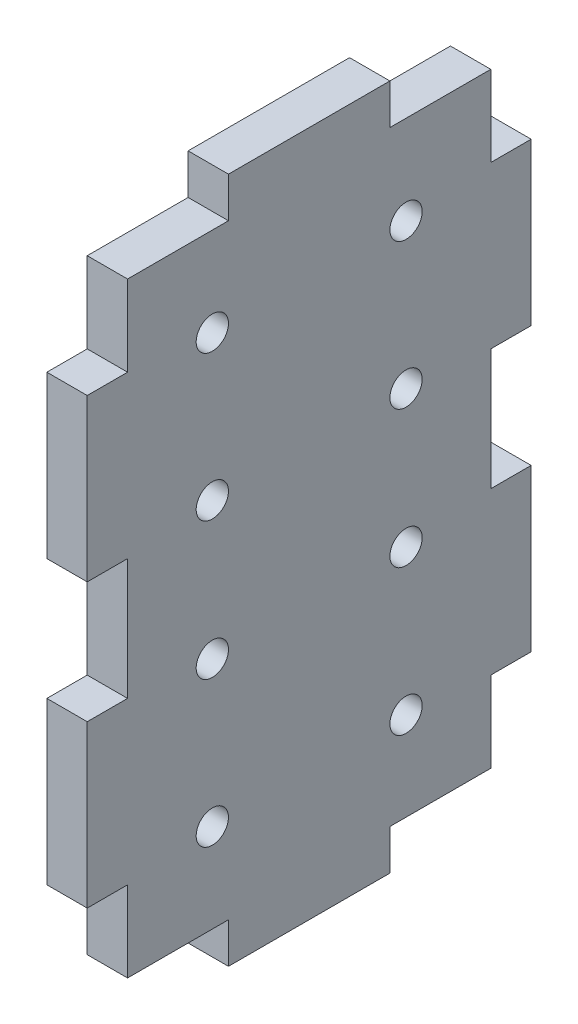
ISO-10303-21;
HEADER;
FILE_DESCRIPTION(('STEP AP214'),'2;1');
FILE_NAME('part.step','',(''),(''),'','','');
FILE_SCHEMA(('AUTOMOTIVE_DESIGN { 1 0 10303 214 1 1 1 1 }'));
ENDSEC;
DATA;
#1=APPLICATION_CONTEXT('core data for automotive mechanical design processes');
#2=APPLICATION_PROTOCOL_DEFINITION('international standard','automotive_design',2000,#1);
#3=PRODUCT_CONTEXT('',#1,'mechanical');
#4=PRODUCT('Part','Part','',(#3));
#5=PRODUCT_RELATED_PRODUCT_CATEGORY('part','',(#4));
#6=PRODUCT_DEFINITION_FORMATION('','',#4);
#7=PRODUCT_DEFINITION_CONTEXT('part definition',#1,'design');
#8=PRODUCT_DEFINITION('design','',#6,#7);
#9=PRODUCT_DEFINITION_SHAPE('','',#8);
#10=(LENGTH_UNIT() NAMED_UNIT(*) SI_UNIT(.MILLI.,.METRE.));
#11=(NAMED_UNIT(*) PLANE_ANGLE_UNIT() SI_UNIT($,.RADIAN.));
#12=(NAMED_UNIT(*) SI_UNIT($,.STERADIAN.) SOLID_ANGLE_UNIT());
#13=UNCERTAINTY_MEASURE_WITH_UNIT(LENGTH_MEASURE(1.E-05),#10,'distance_accuracy_value','');
#14=(GEOMETRIC_REPRESENTATION_CONTEXT(3) GLOBAL_UNCERTAINTY_ASSIGNED_CONTEXT((#13)) GLOBAL_UNIT_ASSIGNED_CONTEXT((#10,
#11,#12)) REPRESENTATION_CONTEXT('',''));
#15=CARTESIAN_POINT('',(0.,0.,0.));
#16=DIRECTION('',(0.,0.,1.));
#17=DIRECTION('',(1.,0.,0.));
#18=AXIS2_PLACEMENT_3D('',#15,#16,#17);
#19=CARTESIAN_POINT('',(5.,0.,0.));
#20=DIRECTION('',(-1.,0.,0.));
#21=DIRECTION('',(0.,0.,1.));
#22=AXIS2_PLACEMENT_3D('',#19,#20,#21);
#23=PLANE('',#22);
#24=DIRECTION('',(0.,1.,0.));
#25=VECTOR('',#24,1.);
#26=CARTESIAN_POINT('',(5.,0.,0.));
#27=LINE('',#26,#25);
#28=CARTESIAN_POINT('',(5.,0.,0.));
#29=VERTEX_POINT('',#28);
#30=CARTESIAN_POINT('',(5.,10.,0.));
#31=VERTEX_POINT('',#30);
#32=EDGE_CURVE('E306',#29,#31,#27,.T.);
#33=ORIENTED_EDGE('',*,*,#32,.T.);
#34=DIRECTION('',(0.,0.,-1.));
#35=VECTOR('',#34,1.);
#36=CARTESIAN_POINT('',(5.,10.,0.));
#37=LINE('',#36,#35);
#38=CARTESIAN_POINT('',(5.,10.,-5.));
#39=VERTEX_POINT('',#38);
#40=EDGE_CURVE('E154',#31,#39,#37,.T.);
#41=ORIENTED_EDGE('',*,*,#40,.T.);
#42=DIRECTION('',(0.,1.,0.));
#43=VECTOR('',#42,1.);
#44=CARTESIAN_POINT('',(5.,10.,-5.));
#45=LINE('',#44,#43);
#46=CARTESIAN_POINT('',(5.,30.,-5.));
#47=VERTEX_POINT('',#46);
#48=EDGE_CURVE('E381',#39,#47,#45,.T.);
#49=ORIENTED_EDGE('',*,*,#48,.T.);
#50=DIRECTION('',(0.,0.,1.));
#51=VECTOR('',#50,1.);
#52=CARTESIAN_POINT('',(5.,30.,0.));
#53=LINE('',#52,#51);
#54=CARTESIAN_POINT('',(5.,30.,0.));
#55=VERTEX_POINT('',#54);
#56=EDGE_CURVE('E400',#47,#55,#53,.T.);
#57=ORIENTED_EDGE('',*,*,#56,.T.);
#58=DIRECTION('',(0.,1.,0.));
#59=VECTOR('',#58,1.);
#60=CARTESIAN_POINT('',(5.,30.,0.));
#61=LINE('',#60,#59);
#62=CARTESIAN_POINT('',(5.,45.,0.));
#63=VERTEX_POINT('',#62);
#64=EDGE_CURVE('E397',#55,#63,#61,.T.);
#65=ORIENTED_EDGE('',*,*,#64,.T.);
#66=DIRECTION('',(0.,0.,-1.));
#67=VECTOR('',#66,1.);
#68=CARTESIAN_POINT('',(5.,45.,0.));
#69=LINE('',#68,#67);
#70=CARTESIAN_POINT('',(5.,45.,-5.));
#71=VERTEX_POINT('',#70);
#72=EDGE_CURVE('E399',#63,#71,#69,.T.);
#73=ORIENTED_EDGE('',*,*,#72,.T.);
#74=DIRECTION('',(0.,1.,0.));
#75=VECTOR('',#74,1.);
#76=CARTESIAN_POINT('',(5.,45.,-5.));
#77=LINE('',#76,#75);
#78=CARTESIAN_POINT('',(5.,65.,-5.));
#79=VERTEX_POINT('',#78);
#80=EDGE_CURVE('E402',#71,#79,#77,.T.);
#81=ORIENTED_EDGE('',*,*,#80,.T.);
#82=DIRECTION('',(0.,0.,1.));
#83=VECTOR('',#82,1.);
#84=CARTESIAN_POINT('',(5.,65.,0.));
#85=LINE('',#84,#83);
#86=CARTESIAN_POINT('',(5.,65.,0.));
#87=VERTEX_POINT('',#86);
#88=EDGE_CURVE('E408',#79,#87,#85,.T.);
#89=ORIENTED_EDGE('',*,*,#88,.T.);
#90=DIRECTION('',(0.,1.,0.));
#91=VECTOR('',#90,1.);
#92=CARTESIAN_POINT('',(5.,65.,0.));
#93=LINE('',#92,#91);
#94=CARTESIAN_POINT('',(5.,75.,0.));
#95=VERTEX_POINT('',#94);
#96=EDGE_CURVE('E410',#87,#95,#93,.T.);
#97=ORIENTED_EDGE('',*,*,#96,.T.);
#98=DIRECTION('',(0.,0.,1.));
#99=VECTOR('',#98,1.);
#100=CARTESIAN_POINT('',(5.,75.,0.));
#101=LINE('',#100,#99);
#102=CARTESIAN_POINT('',(5.,75.,12.5));
#103=VERTEX_POINT('',#102);
#104=EDGE_CURVE('E412',#95,#103,#101,.T.);
#105=ORIENTED_EDGE('',*,*,#104,.T.);
#106=DIRECTION('',(0.,1.,0.));
#107=VECTOR('',#106,1.);
#108=CARTESIAN_POINT('',(5.,75.,12.5));
#109=LINE('',#108,#107);
#110=CARTESIAN_POINT('',(5.,80.,12.5));
#111=VERTEX_POINT('',#110);
#112=EDGE_CURVE('E414',#103,#111,#109,.T.);
#113=ORIENTED_EDGE('',*,*,#112,.T.);
#114=DIRECTION('',(0.,0.,1.));
#115=VECTOR('',#114,1.);
#116=CARTESIAN_POINT('',(5.,80.,12.5));
#117=LINE('',#116,#115);
#118=CARTESIAN_POINT('',(5.,80.,32.5));
#119=VERTEX_POINT('',#118);
#120=EDGE_CURVE('E416',#111,#119,#117,.T.);
#121=ORIENTED_EDGE('',*,*,#120,.T.);
#122=DIRECTION('',(0.,-1.,0.));
#123=VECTOR('',#122,1.);
#124=CARTESIAN_POINT('',(5.,75.,32.5));
#125=LINE('',#124,#123);
#126=CARTESIAN_POINT('',(5.,75.,32.5));
#127=VERTEX_POINT('',#126);
#128=EDGE_CURVE('E418',#119,#127,#125,.T.);
#129=ORIENTED_EDGE('',*,*,#128,.T.);
#130=DIRECTION('',(0.,0.,1.));
#131=VECTOR('',#130,1.);
#132=CARTESIAN_POINT('',(5.,75.,32.5));
#133=LINE('',#132,#131);
#134=CARTESIAN_POINT('',(5.,75.,45.));
#135=VERTEX_POINT('',#134);
#136=EDGE_CURVE('E420',#127,#135,#133,.T.);
#137=ORIENTED_EDGE('',*,*,#136,.T.);
#138=DIRECTION('',(0.,-1.,0.));
#139=VECTOR('',#138,1.);
#140=CARTESIAN_POINT('',(5.,65.,45.));
#141=LINE('',#140,#139);
#142=CARTESIAN_POINT('',(5.,65.,45.));
#143=VERTEX_POINT('',#142);
#144=EDGE_CURVE('E422',#135,#143,#141,.T.);
#145=ORIENTED_EDGE('',*,*,#144,.T.);
#146=DIRECTION('',(0.,0.,1.));
#147=VECTOR('',#146,1.);
#148=CARTESIAN_POINT('',(5.,65.,45.));
#149=LINE('',#148,#147);
#150=CARTESIAN_POINT('',(5.,65.,50.));
#151=VERTEX_POINT('',#150);
#152=EDGE_CURVE('E424',#143,#151,#149,.T.);
#153=ORIENTED_EDGE('',*,*,#152,.T.);
#154=DIRECTION('',(0.,-1.,0.));
#155=VECTOR('',#154,1.);
#156=CARTESIAN_POINT('',(5.,65.,50.));
#157=LINE('',#156,#155);
#158=CARTESIAN_POINT('',(5.,45.,50.));
#159=VERTEX_POINT('',#158);
#160=EDGE_CURVE('E426',#151,#159,#157,.T.);
#161=ORIENTED_EDGE('',*,*,#160,.T.);
#162=DIRECTION('',(0.,0.,-1.));
#163=VECTOR('',#162,1.);
#164=CARTESIAN_POINT('',(5.,45.,45.));
#165=LINE('',#164,#163);
#166=CARTESIAN_POINT('',(5.,45.,45.));
#167=VERTEX_POINT('',#166);
#168=EDGE_CURVE('E428',#159,#167,#165,.T.);
#169=ORIENTED_EDGE('',*,*,#168,.T.);
#170=DIRECTION('',(0.,-1.,0.));
#171=VECTOR('',#170,1.);
#172=CARTESIAN_POINT('',(5.,30.,45.));
#173=LINE('',#172,#171);
#174=CARTESIAN_POINT('',(5.,30.,45.));
#175=VERTEX_POINT('',#174);
#176=EDGE_CURVE('E430',#167,#175,#173,.T.);
#177=ORIENTED_EDGE('',*,*,#176,.T.);
#178=DIRECTION('',(0.,0.,1.));
#179=VECTOR('',#178,1.);
#180=CARTESIAN_POINT('',(5.,30.,45.));
#181=LINE('',#180,#179);
#182=CARTESIAN_POINT('',(5.,30.,50.));
#183=VERTEX_POINT('',#182);
#184=EDGE_CURVE('E432',#175,#183,#181,.T.);
#185=ORIENTED_EDGE('',*,*,#184,.T.);
#186=DIRECTION('',(0.,-1.,0.));
#187=VECTOR('',#186,1.);
#188=CARTESIAN_POINT('',(5.,30.,50.));
#189=LINE('',#188,#187);
#190=CARTESIAN_POINT('',(5.,9.99999999999999,50.));
#191=VERTEX_POINT('',#190);
#192=EDGE_CURVE('E434',#183,#191,#189,.T.);
#193=ORIENTED_EDGE('',*,*,#192,.T.);
#194=DIRECTION('',(0.,0.,-1.));
#195=VECTOR('',#194,1.);
#196=CARTESIAN_POINT('',(5.,9.99999999999999,45.));
#197=LINE('',#196,#195);
#198=CARTESIAN_POINT('',(5.,9.99999999999999,45.));
#199=VERTEX_POINT('',#198);
#200=EDGE_CURVE('E436',#191,#199,#197,.T.);
#201=ORIENTED_EDGE('',*,*,#200,.T.);
#202=DIRECTION('',(0.,-1.,0.));
#203=VECTOR('',#202,1.);
#204=CARTESIAN_POINT('',(5.,0.,45.));
#205=LINE('',#204,#203);
#206=CARTESIAN_POINT('',(5.,0.,45.));
#207=VERTEX_POINT('',#206);
#208=EDGE_CURVE('E438',#199,#207,#205,.T.);
#209=ORIENTED_EDGE('',*,*,#208,.T.);
#210=DIRECTION('',(0.,0.,-1.));
#211=VECTOR('',#210,1.);
#212=CARTESIAN_POINT('',(5.,0.,32.5));
#213=LINE('',#212,#211);
#214=CARTESIAN_POINT('',(5.,0.,32.5));
#215=VERTEX_POINT('',#214);
#216=EDGE_CURVE('E440',#207,#215,#213,.T.);
#217=ORIENTED_EDGE('',*,*,#216,.T.);
#218=DIRECTION('',(0.,-1.,0.));
#219=VECTOR('',#218,1.);
#220=CARTESIAN_POINT('',(5.,0.,32.5));
#221=LINE('',#220,#219);
#222=CARTESIAN_POINT('',(5.,-5.,32.5));
#223=VERTEX_POINT('',#222);
#224=EDGE_CURVE('E233',#215,#223,#221,.T.);
#225=ORIENTED_EDGE('',*,*,#224,.T.);
#226=DIRECTION('',(0.,0.,-1.));
#227=VECTOR('',#226,1.);
#228=CARTESIAN_POINT('',(5.,-5.,32.5));
#229=LINE('',#228,#227);
#230=CARTESIAN_POINT('',(5.,-5.,12.5));
#231=VERTEX_POINT('',#230);
#232=EDGE_CURVE('E227',#223,#231,#229,.T.);
#233=ORIENTED_EDGE('',*,*,#232,.T.);
#234=DIRECTION('',(0.,1.,0.));
#235=VECTOR('',#234,1.);
#236=CARTESIAN_POINT('',(5.,0.,12.5));
#237=LINE('',#236,#235);
#238=CARTESIAN_POINT('',(5.,0.,12.5));
#239=VERTEX_POINT('',#238);
#240=EDGE_CURVE('E231',#231,#239,#237,.T.);
#241=ORIENTED_EDGE('',*,*,#240,.T.);
#242=DIRECTION('',(0.,0.,-1.));
#243=VECTOR('',#242,1.);
#244=CARTESIAN_POINT('',(5.,0.,0.));
#245=LINE('',#244,#243);
#246=EDGE_CURVE('E51',#239,#29,#245,.T.);
#247=ORIENTED_EDGE('',*,*,#246,.T.);
#248=EDGE_LOOP('',(#33,#41,#49,#57,#65,#73,#81,#89,#97,#105,#113,#121,#129,#137,#145,#153,#161,
#169,#177,#185,#193,#201,#209,#217,#225,#233,#241,#247));
#249=FACE_BOUND('',#248,.T.);
#250=CARTESIAN_POINT('',(5.,64.,34.5));
#251=DIRECTION('',(1.,0.,0.));
#252=DIRECTION('',(0.,0.,-1.));
#253=AXIS2_PLACEMENT_3D('',#250,#251,#252);
#254=CIRCLE('',#253,2.);
#255=CARTESIAN_POINT('',(5.,64.,32.5));
#256=VERTEX_POINT('',#255);
#257=EDGE_CURVE('E255',#256,#256,#254,.T.);
#258=ORIENTED_EDGE('',*,*,#257,.F.);
#259=EDGE_LOOP('',(#258));
#260=FACE_BOUND('',#259,.T.);
#261=CARTESIAN_POINT('',(5.,64.0000000000003,10.5));
#262=DIRECTION('',(1.,0.,0.));
#263=DIRECTION('',(0.,0.,-1.));
#264=AXIS2_PLACEMENT_3D('',#261,#262,#263);
#265=CIRCLE('',#264,2.);
#266=CARTESIAN_POINT('',(5.,64.0000000000003,8.49999999999999));
#267=VERTEX_POINT('',#266);
#268=EDGE_CURVE('E544',#267,#267,#265,.T.);
#269=ORIENTED_EDGE('',*,*,#268,.F.);
#270=EDGE_LOOP('',(#269));
#271=FACE_BOUND('',#270,.T.);
#272=CARTESIAN_POINT('',(5.,46.,34.4999999999998));
#273=DIRECTION('',(1.,0.,0.));
#274=DIRECTION('',(0.,0.,-1.));
#275=AXIS2_PLACEMENT_3D('',#272,#273,#274);
#276=CIRCLE('',#275,2.);
#277=CARTESIAN_POINT('',(5.,46.,32.4999999999998));
#278=VERTEX_POINT('',#277);
#279=EDGE_CURVE('E538',#278,#278,#276,.T.);
#280=ORIENTED_EDGE('',*,*,#279,.F.);
#281=EDGE_LOOP('',(#280));
#282=FACE_BOUND('',#281,.T.);
#283=CARTESIAN_POINT('',(5.,46.0000000000003,10.4999999999998));
#284=DIRECTION('',(1.,0.,0.));
#285=DIRECTION('',(0.,0.,-1.));
#286=AXIS2_PLACEMENT_3D('',#283,#284,#285);
#287=CIRCLE('',#286,2.);
#288=CARTESIAN_POINT('',(5.,46.0000000000003,8.4999999999998));
#289=VERTEX_POINT('',#288);
#290=EDGE_CURVE('E532',#289,#289,#287,.T.);
#291=ORIENTED_EDGE('',*,*,#290,.F.);
#292=EDGE_LOOP('',(#291));
#293=FACE_BOUND('',#292,.T.);
#294=CARTESIAN_POINT('',(5.,11.,34.4999999999998));
#295=DIRECTION('',(1.,0.,0.));
#296=DIRECTION('',(0.,0.,-1.));
#297=AXIS2_PLACEMENT_3D('',#294,#295,#296);
#298=CIRCLE('',#297,2.);
#299=CARTESIAN_POINT('',(5.,11.,32.4999999999998));
#300=VERTEX_POINT('',#299);
#301=EDGE_CURVE('E526',#300,#300,#298,.T.);
#302=ORIENTED_EDGE('',*,*,#301,.F.);
#303=EDGE_LOOP('',(#302));
#304=FACE_BOUND('',#303,.T.);
#305=CARTESIAN_POINT('',(5.,11.,10.4999999999998));
#306=DIRECTION('',(1.,0.,0.));
#307=DIRECTION('',(0.,0.,-1.));
#308=AXIS2_PLACEMENT_3D('',#305,#306,#307);
#309=CIRCLE('',#308,2.);
#310=CARTESIAN_POINT('',(5.,11.,8.49999999999981));
#311=VERTEX_POINT('',#310);
#312=EDGE_CURVE('E520',#311,#311,#309,.T.);
#313=ORIENTED_EDGE('',*,*,#312,.F.);
#314=EDGE_LOOP('',(#313));
#315=FACE_BOUND('',#314,.T.);
#316=CARTESIAN_POINT('',(5.,29.,10.4999999999999));
#317=DIRECTION('',(1.,0.,0.));
#318=DIRECTION('',(0.,0.,-1.));
#319=AXIS2_PLACEMENT_3D('',#316,#317,#318);
#320=CIRCLE('',#319,2.);
#321=CARTESIAN_POINT('',(5.,29.,8.49999999999987));
#322=VERTEX_POINT('',#321);
#323=EDGE_CURVE('E514',#322,#322,#320,.T.);
#324=ORIENTED_EDGE('',*,*,#323,.F.);
#325=EDGE_LOOP('',(#324));
#326=FACE_BOUND('',#325,.T.);
#327=CARTESIAN_POINT('',(5.,29.,34.4999999999999));
#328=DIRECTION('',(1.,0.,0.));
#329=DIRECTION('',(0.,0.,-1.));
#330=AXIS2_PLACEMENT_3D('',#327,#328,#329);
#331=CIRCLE('',#330,2.);
#332=CARTESIAN_POINT('',(5.,29.,32.4999999999999));
#333=VERTEX_POINT('',#332);
#334=EDGE_CURVE('E505',#333,#333,#331,.T.);
#335=ORIENTED_EDGE('',*,*,#334,.F.);
#336=EDGE_LOOP('',(#335));
#337=FACE_BOUND('',#336,.T.);
#338=ADVANCED_FACE('F34',(#249,#260,#271,#282,#293,#304,#315,#326,#337),#23,.F.);
#339=CARTESIAN_POINT('',(0.,0.,0.));
#340=DIRECTION('',(-1.,0.,0.));
#341=DIRECTION('',(0.,0.,1.));
#342=AXIS2_PLACEMENT_3D('',#339,#340,#341);
#343=PLANE('',#342);
#344=CARTESIAN_POINT('',(0.,29.,10.4999999999999));
#345=DIRECTION('',(1.,0.,0.));
#346=DIRECTION('',(0.,0.,-1.));
#347=AXIS2_PLACEMENT_3D('',#344,#345,#346);
#348=CIRCLE('',#347,2.);
#349=CARTESIAN_POINT('',(0.,29.,8.49999999999987));
#350=VERTEX_POINT('',#349);
#351=EDGE_CURVE('E511',#350,#350,#348,.T.);
#352=ORIENTED_EDGE('',*,*,#351,.T.);
#353=EDGE_LOOP('',(#352));
#354=FACE_BOUND('',#353,.T.);
#355=CARTESIAN_POINT('',(0.,11.,34.4999999999998));
#356=DIRECTION('',(1.,0.,0.));
#357=DIRECTION('',(0.,0.,-1.));
#358=AXIS2_PLACEMENT_3D('',#355,#356,#357);
#359=CIRCLE('',#358,2.);
#360=CARTESIAN_POINT('',(0.,11.,32.4999999999998));
#361=VERTEX_POINT('',#360);
#362=EDGE_CURVE('E523',#361,#361,#359,.T.);
#363=ORIENTED_EDGE('',*,*,#362,.T.);
#364=EDGE_LOOP('',(#363));
#365=FACE_BOUND('',#364,.T.);
#366=CARTESIAN_POINT('',(0.,46.,34.4999999999998));
#367=DIRECTION('',(1.,0.,0.));
#368=DIRECTION('',(0.,0.,-1.));
#369=AXIS2_PLACEMENT_3D('',#366,#367,#368);
#370=CIRCLE('',#369,2.);
#371=CARTESIAN_POINT('',(0.,46.,32.4999999999998));
#372=VERTEX_POINT('',#371);
#373=EDGE_CURVE('E535',#372,#372,#370,.T.);
#374=ORIENTED_EDGE('',*,*,#373,.T.);
#375=EDGE_LOOP('',(#374));
#376=FACE_BOUND('',#375,.T.);
#377=CARTESIAN_POINT('',(0.,64.,34.5));
#378=DIRECTION('',(1.,0.,0.));
#379=DIRECTION('',(0.,0.,-1.));
#380=AXIS2_PLACEMENT_3D('',#377,#378,#379);
#381=CIRCLE('',#380,2.);
#382=CARTESIAN_POINT('',(0.,64.,32.5));
#383=VERTEX_POINT('',#382);
#384=EDGE_CURVE('E547',#383,#383,#381,.T.);
#385=ORIENTED_EDGE('',*,*,#384,.T.);
#386=EDGE_LOOP('',(#385));
#387=FACE_BOUND('',#386,.T.);
#388=DIRECTION('',(0.,1.,0.));
#389=VECTOR('',#388,1.);
#390=CARTESIAN_POINT('',(0.,0.,0.));
#391=LINE('',#390,#389);
#392=CARTESIAN_POINT('',(0.,0.,0.));
#393=VERTEX_POINT('',#392);
#394=CARTESIAN_POINT('',(0.,10.,0.));
#395=VERTEX_POINT('',#394);
#396=EDGE_CURVE('E251',#393,#395,#391,.T.);
#397=ORIENTED_EDGE('',*,*,#396,.F.);
#398=DIRECTION('',(0.,0.,-1.));
#399=VECTOR('',#398,1.);
#400=CARTESIAN_POINT('',(0.,0.,0.));
#401=LINE('',#400,#399);
#402=CARTESIAN_POINT('',(0.,0.,12.5));
#403=VERTEX_POINT('',#402);
#404=EDGE_CURVE('E146',#403,#393,#401,.T.);
#405=ORIENTED_EDGE('',*,*,#404,.F.);
#406=DIRECTION('',(0.,1.,0.));
#407=VECTOR('',#406,1.);
#408=CARTESIAN_POINT('',(0.,0.,12.5));
#409=LINE('',#408,#407);
#410=CARTESIAN_POINT('',(0.,-5.,12.5));
#411=VERTEX_POINT('',#410);
#412=EDGE_CURVE('E140',#411,#403,#409,.T.);
#413=ORIENTED_EDGE('',*,*,#412,.F.);
#414=DIRECTION('',(0.,0.,-1.));
#415=VECTOR('',#414,1.);
#416=CARTESIAN_POINT('',(0.,-5.,32.5));
#417=LINE('',#416,#415);
#418=CARTESIAN_POINT('',(0.,-5.,32.5));
#419=VERTEX_POINT('',#418);
#420=EDGE_CURVE('E241',#419,#411,#417,.T.);
#421=ORIENTED_EDGE('',*,*,#420,.F.);
#422=DIRECTION('',(0.,-1.,0.));
#423=VECTOR('',#422,1.);
#424=CARTESIAN_POINT('',(0.,0.,32.5));
#425=LINE('',#424,#423);
#426=CARTESIAN_POINT('',(0.,0.,32.5));
#427=VERTEX_POINT('',#426);
#428=EDGE_CURVE('E301',#427,#419,#425,.T.);
#429=ORIENTED_EDGE('',*,*,#428,.F.);
#430=DIRECTION('',(0.,0.,-1.));
#431=VECTOR('',#430,1.);
#432=CARTESIAN_POINT('',(0.,0.,32.5));
#433=LINE('',#432,#431);
#434=CARTESIAN_POINT('',(0.,0.,45.));
#435=VERTEX_POINT('',#434);
#436=EDGE_CURVE('E299',#435,#427,#433,.T.);
#437=ORIENTED_EDGE('',*,*,#436,.F.);
#438=DIRECTION('',(0.,-1.,0.));
#439=VECTOR('',#438,1.);
#440=CARTESIAN_POINT('',(0.,0.,45.));
#441=LINE('',#440,#439);
#442=CARTESIAN_POINT('',(0.,9.99999999999999,45.));
#443=VERTEX_POINT('',#442);
#444=EDGE_CURVE('E297',#443,#435,#441,.T.);
#445=ORIENTED_EDGE('',*,*,#444,.F.);
#446=DIRECTION('',(0.,0.,-1.));
#447=VECTOR('',#446,1.);
#448=CARTESIAN_POINT('',(0.,9.99999999999999,45.));
#449=LINE('',#448,#447);
#450=CARTESIAN_POINT('',(0.,9.99999999999999,50.));
#451=VERTEX_POINT('',#450);
#452=EDGE_CURVE('E295',#451,#443,#449,.T.);
#453=ORIENTED_EDGE('',*,*,#452,.F.);
#454=DIRECTION('',(0.,-1.,0.));
#455=VECTOR('',#454,1.);
#456=CARTESIAN_POINT('',(0.,30.,50.));
#457=LINE('',#456,#455);
#458=CARTESIAN_POINT('',(0.,30.,50.));
#459=VERTEX_POINT('',#458);
#460=EDGE_CURVE('E293',#459,#451,#457,.T.);
#461=ORIENTED_EDGE('',*,*,#460,.F.);
#462=DIRECTION('',(0.,0.,1.));
#463=VECTOR('',#462,1.);
#464=CARTESIAN_POINT('',(0.,30.,45.));
#465=LINE('',#464,#463);
#466=CARTESIAN_POINT('',(0.,30.,45.));
#467=VERTEX_POINT('',#466);
#468=EDGE_CURVE('E291',#467,#459,#465,.T.);
#469=ORIENTED_EDGE('',*,*,#468,.F.);
#470=DIRECTION('',(0.,-1.,0.));
#471=VECTOR('',#470,1.);
#472=CARTESIAN_POINT('',(0.,30.,45.));
#473=LINE('',#472,#471);
#474=CARTESIAN_POINT('',(0.,45.,45.));
#475=VERTEX_POINT('',#474);
#476=EDGE_CURVE('E289',#475,#467,#473,.T.);
#477=ORIENTED_EDGE('',*,*,#476,.F.);
#478=DIRECTION('',(0.,0.,-1.));
#479=VECTOR('',#478,1.);
#480=CARTESIAN_POINT('',(0.,45.,45.));
#481=LINE('',#480,#479);
#482=CARTESIAN_POINT('',(0.,45.,50.));
#483=VERTEX_POINT('',#482);
#484=EDGE_CURVE('E287',#483,#475,#481,.T.);
#485=ORIENTED_EDGE('',*,*,#484,.F.);
#486=DIRECTION('',(0.,-1.,0.));
#487=VECTOR('',#486,1.);
#488=CARTESIAN_POINT('',(0.,65.,50.));
#489=LINE('',#488,#487);
#490=CARTESIAN_POINT('',(0.,65.,50.));
#491=VERTEX_POINT('',#490);
#492=EDGE_CURVE('E285',#491,#483,#489,.T.);
#493=ORIENTED_EDGE('',*,*,#492,.F.);
#494=DIRECTION('',(0.,0.,1.));
#495=VECTOR('',#494,1.);
#496=CARTESIAN_POINT('',(0.,65.,45.));
#497=LINE('',#496,#495);
#498=CARTESIAN_POINT('',(0.,65.,45.));
#499=VERTEX_POINT('',#498);
#500=EDGE_CURVE('E283',#499,#491,#497,.T.);
#501=ORIENTED_EDGE('',*,*,#500,.F.);
#502=DIRECTION('',(0.,-1.,0.));
#503=VECTOR('',#502,1.);
#504=CARTESIAN_POINT('',(0.,65.,45.));
#505=LINE('',#504,#503);
#506=CARTESIAN_POINT('',(0.,75.,45.));
#507=VERTEX_POINT('',#506);
#508=EDGE_CURVE('E281',#507,#499,#505,.T.);
#509=ORIENTED_EDGE('',*,*,#508,.F.);
#510=DIRECTION('',(0.,0.,1.));
#511=VECTOR('',#510,1.);
#512=CARTESIAN_POINT('',(0.,75.,32.5));
#513=LINE('',#512,#511);
#514=CARTESIAN_POINT('',(0.,75.,32.5));
#515=VERTEX_POINT('',#514);
#516=EDGE_CURVE('E279',#515,#507,#513,.T.);
#517=ORIENTED_EDGE('',*,*,#516,.F.);
#518=DIRECTION('',(0.,-1.,0.));
#519=VECTOR('',#518,1.);
#520=CARTESIAN_POINT('',(0.,75.,32.5));
#521=LINE('',#520,#519);
#522=CARTESIAN_POINT('',(0.,80.,32.5));
#523=VERTEX_POINT('',#522);
#524=EDGE_CURVE('E277',#523,#515,#521,.T.);
#525=ORIENTED_EDGE('',*,*,#524,.F.);
#526=DIRECTION('',(0.,0.,1.));
#527=VECTOR('',#526,1.);
#528=CARTESIAN_POINT('',(0.,80.,12.5));
#529=LINE('',#528,#527);
#530=CARTESIAN_POINT('',(0.,80.,12.5));
#531=VERTEX_POINT('',#530);
#532=EDGE_CURVE('E275',#531,#523,#529,.T.);
#533=ORIENTED_EDGE('',*,*,#532,.F.);
#534=DIRECTION('',(0.,1.,0.));
#535=VECTOR('',#534,1.);
#536=CARTESIAN_POINT('',(0.,75.,12.5));
#537=LINE('',#536,#535);
#538=CARTESIAN_POINT('',(0.,75.,12.5));
#539=VERTEX_POINT('',#538);
#540=EDGE_CURVE('E273',#539,#531,#537,.T.);
#541=ORIENTED_EDGE('',*,*,#540,.F.);
#542=DIRECTION('',(0.,0.,1.));
#543=VECTOR('',#542,1.);
#544=CARTESIAN_POINT('',(0.,75.,0.));
#545=LINE('',#544,#543);
#546=CARTESIAN_POINT('',(0.,75.,0.));
#547=VERTEX_POINT('',#546);
#548=EDGE_CURVE('E271',#547,#539,#545,.T.);
#549=ORIENTED_EDGE('',*,*,#548,.F.);
#550=DIRECTION('',(0.,1.,0.));
#551=VECTOR('',#550,1.);
#552=CARTESIAN_POINT('',(0.,65.,0.));
#553=LINE('',#552,#551);
#554=CARTESIAN_POINT('',(0.,65.,0.));
#555=VERTEX_POINT('',#554);
#556=EDGE_CURVE('E269',#555,#547,#553,.T.);
#557=ORIENTED_EDGE('',*,*,#556,.F.);
#558=DIRECTION('',(0.,0.,1.));
#559=VECTOR('',#558,1.);
#560=CARTESIAN_POINT('',(0.,65.,0.));
#561=LINE('',#560,#559);
#562=CARTESIAN_POINT('',(0.,65.,-5.));
#563=VERTEX_POINT('',#562);
#564=EDGE_CURVE('E267',#563,#555,#561,.T.);
#565=ORIENTED_EDGE('',*,*,#564,.F.);
#566=DIRECTION('',(0.,1.,0.));
#567=VECTOR('',#566,1.);
#568=CARTESIAN_POINT('',(0.,45.,-5.));
#569=LINE('',#568,#567);
#570=CARTESIAN_POINT('',(0.,45.,-5.));
#571=VERTEX_POINT('',#570);
#572=EDGE_CURVE('E265',#571,#563,#569,.T.);
#573=ORIENTED_EDGE('',*,*,#572,.F.);
#574=DIRECTION('',(0.,0.,-1.));
#575=VECTOR('',#574,1.);
#576=CARTESIAN_POINT('',(0.,45.,0.));
#577=LINE('',#576,#575);
#578=CARTESIAN_POINT('',(0.,45.,0.));
#579=VERTEX_POINT('',#578);
#580=EDGE_CURVE('E263',#579,#571,#577,.T.);
#581=ORIENTED_EDGE('',*,*,#580,.F.);
#582=DIRECTION('',(0.,1.,0.));
#583=VECTOR('',#582,1.);
#584=CARTESIAN_POINT('',(0.,30.,0.));
#585=LINE('',#584,#583);
#586=CARTESIAN_POINT('',(0.,30.,0.));
#587=VERTEX_POINT('',#586);
#588=EDGE_CURVE('E261',#587,#579,#585,.T.);
#589=ORIENTED_EDGE('',*,*,#588,.F.);
#590=DIRECTION('',(0.,0.,1.));
#591=VECTOR('',#590,1.);
#592=CARTESIAN_POINT('',(0.,30.,0.));
#593=LINE('',#592,#591);
#594=CARTESIAN_POINT('',(0.,30.,-5.));
#595=VERTEX_POINT('',#594);
#596=EDGE_CURVE('E259',#595,#587,#593,.T.);
#597=ORIENTED_EDGE('',*,*,#596,.F.);
#598=DIRECTION('',(0.,1.,0.));
#599=VECTOR('',#598,1.);
#600=CARTESIAN_POINT('',(0.,10.,-5.));
#601=LINE('',#600,#599);
#602=CARTESIAN_POINT('',(0.,10.,-5.));
#603=VERTEX_POINT('',#602);
#604=EDGE_CURVE('E257',#603,#595,#601,.T.);
#605=ORIENTED_EDGE('',*,*,#604,.F.);
#606=DIRECTION('',(0.,0.,-1.));
#607=VECTOR('',#606,1.);
#608=CARTESIAN_POINT('',(0.,10.,0.));
#609=LINE('',#608,#607);
#610=EDGE_CURVE('E254',#395,#603,#609,.T.);
#611=ORIENTED_EDGE('',*,*,#610,.F.);
#612=EDGE_LOOP('',(#397,#405,#413,#421,#429,#437,#445,#453,#461,#469,#477,#485,#493,#501,#509,
#517,#525,#533,#541,#549,#557,#565,#573,#581,#589,#597,#605,#611));
#613=FACE_BOUND('',#612,.T.);
#614=CARTESIAN_POINT('',(0.,64.0000000000003,10.5));
#615=DIRECTION('',(1.,0.,0.));
#616=DIRECTION('',(0.,0.,-1.));
#617=AXIS2_PLACEMENT_3D('',#614,#615,#616);
#618=CIRCLE('',#617,2.);
#619=CARTESIAN_POINT('',(0.,64.0000000000003,8.49999999999999));
#620=VERTEX_POINT('',#619);
#621=EDGE_CURVE('E541',#620,#620,#618,.T.);
#622=ORIENTED_EDGE('',*,*,#621,.T.);
#623=EDGE_LOOP('',(#622));
#624=FACE_BOUND('',#623,.T.);
#625=CARTESIAN_POINT('',(0.,46.0000000000003,10.4999999999998));
#626=DIRECTION('',(1.,0.,0.));
#627=DIRECTION('',(0.,0.,-1.));
#628=AXIS2_PLACEMENT_3D('',#625,#626,#627);
#629=CIRCLE('',#628,2.);
#630=CARTESIAN_POINT('',(0.,46.0000000000003,8.4999999999998));
#631=VERTEX_POINT('',#630);
#632=EDGE_CURVE('E529',#631,#631,#629,.T.);
#633=ORIENTED_EDGE('',*,*,#632,.T.);
#634=EDGE_LOOP('',(#633));
#635=FACE_BOUND('',#634,.T.);
#636=CARTESIAN_POINT('',(0.,11.,10.4999999999998));
#637=DIRECTION('',(1.,0.,0.));
#638=DIRECTION('',(0.,0.,-1.));
#639=AXIS2_PLACEMENT_3D('',#636,#637,#638);
#640=CIRCLE('',#639,2.);
#641=CARTESIAN_POINT('',(0.,11.,8.49999999999981));
#642=VERTEX_POINT('',#641);
#643=EDGE_CURVE('E517',#642,#642,#640,.T.);
#644=ORIENTED_EDGE('',*,*,#643,.T.);
#645=EDGE_LOOP('',(#644));
#646=FACE_BOUND('',#645,.T.);
#647=CARTESIAN_POINT('',(0.,29.,34.4999999999999));
#648=DIRECTION('',(1.,0.,0.));
#649=DIRECTION('',(0.,0.,-1.));
#650=AXIS2_PLACEMENT_3D('',#647,#648,#649);
#651=CIRCLE('',#650,2.);
#652=CARTESIAN_POINT('',(0.,29.,32.4999999999999));
#653=VERTEX_POINT('',#652);
#654=EDGE_CURVE('E508',#653,#653,#651,.T.);
#655=ORIENTED_EDGE('',*,*,#654,.T.);
#656=EDGE_LOOP('',(#655));
#657=FACE_BOUND('',#656,.T.);
#658=ADVANCED_FACE('F385',(#354,#365,#376,#387,#613,#624,#635,#646,#657),#343,.T.);
#659=CARTESIAN_POINT('',(5.,0.,0.));
#660=DIRECTION('',(0.,0.,1.));
#661=DIRECTION('',(1.,0.,0.));
#662=AXIS2_PLACEMENT_3D('',#659,#660,#661);
#663=PLANE('',#662);
#664=ORIENTED_EDGE('',*,*,#396,.T.);
#665=DIRECTION('',(-1.,0.,0.));
#666=VECTOR('',#665,1.);
#667=CARTESIAN_POINT('',(5.,10.,0.));
#668=LINE('',#667,#666);
#669=EDGE_CURVE('E11',#31,#395,#668,.T.);
#670=ORIENTED_EDGE('',*,*,#669,.F.);
#671=ORIENTED_EDGE('',*,*,#32,.F.);
#672=DIRECTION('',(-1.,0.,0.));
#673=VECTOR('',#672,1.);
#674=CARTESIAN_POINT('',(5.,0.,0.));
#675=LINE('',#674,#673);
#676=EDGE_CURVE('E247',#29,#393,#675,.T.);
#677=ORIENTED_EDGE('',*,*,#676,.T.);
#678=EDGE_LOOP('',(#664,#670,#671,#677));
#679=FACE_BOUND('',#678,.T.);
#680=ADVANCED_FACE('F36',(#679),#663,.F.);
#681=CARTESIAN_POINT('',(5.,10.,0.));
#682=DIRECTION('',(0.,1.,0.));
#683=DIRECTION('',(0.,0.,1.));
#684=AXIS2_PLACEMENT_3D('',#681,#682,#683);
#685=PLANE('',#684);
#686=ORIENTED_EDGE('',*,*,#610,.T.);
#687=DIRECTION('',(-1.,0.,0.));
#688=VECTOR('',#687,1.);
#689=CARTESIAN_POINT('',(5.,10.,-5.));
#690=LINE('',#689,#688);
#691=EDGE_CURVE('E43',#39,#603,#690,.T.);
#692=ORIENTED_EDGE('',*,*,#691,.F.);
#693=ORIENTED_EDGE('',*,*,#40,.F.);
#694=ORIENTED_EDGE('',*,*,#669,.T.);
#695=EDGE_LOOP('',(#686,#692,#693,#694));
#696=FACE_BOUND('',#695,.T.);
#697=ADVANCED_FACE('F855',(#696),#685,.F.);
#698=CARTESIAN_POINT('',(5.,10.,-5.));
#699=DIRECTION('',(0.,0.,1.));
#700=DIRECTION('',(0.,-1.,0.));
#701=AXIS2_PLACEMENT_3D('',#698,#699,#700);
#702=PLANE('',#701);
#703=ORIENTED_EDGE('',*,*,#604,.T.);
#704=DIRECTION('',(-1.,0.,0.));
#705=VECTOR('',#704,1.);
#706=CARTESIAN_POINT('',(5.,30.,-5.));
#707=LINE('',#706,#705);
#708=EDGE_CURVE('E373',#47,#595,#707,.T.);
#709=ORIENTED_EDGE('',*,*,#708,.F.);
#710=ORIENTED_EDGE('',*,*,#48,.F.);
#711=ORIENTED_EDGE('',*,*,#691,.T.);
#712=EDGE_LOOP('',(#703,#709,#710,#711));
#713=FACE_BOUND('',#712,.T.);
#714=ADVANCED_FACE('F379',(#713),#702,.F.);
#715=CARTESIAN_POINT('',(5.,30.,0.));
#716=DIRECTION('',(0.,-1.,0.));
#717=DIRECTION('',(0.,0.,-1.));
#718=AXIS2_PLACEMENT_3D('',#715,#716,#717);
#719=PLANE('',#718);
#720=ORIENTED_EDGE('',*,*,#596,.T.);
#721=DIRECTION('',(-1.,0.,0.));
#722=VECTOR('',#721,1.);
#723=CARTESIAN_POINT('',(5.,30.,0.));
#724=LINE('',#723,#722);
#725=EDGE_CURVE('E370',#55,#587,#724,.T.);
#726=ORIENTED_EDGE('',*,*,#725,.F.);
#727=ORIENTED_EDGE('',*,*,#56,.F.);
#728=ORIENTED_EDGE('',*,*,#708,.T.);
#729=EDGE_LOOP('',(#720,#726,#727,#728));
#730=FACE_BOUND('',#729,.T.);
#731=ADVANCED_FACE('F391',(#730),#719,.F.);
#732=CARTESIAN_POINT('',(5.,30.,0.));
#733=DIRECTION('',(0.,0.,1.));
#734=DIRECTION('',(0.,-1.,0.));
#735=AXIS2_PLACEMENT_3D('',#732,#733,#734);
#736=PLANE('',#735);
#737=ORIENTED_EDGE('',*,*,#588,.T.);
#738=DIRECTION('',(-1.,0.,0.));
#739=VECTOR('',#738,1.);
#740=CARTESIAN_POINT('',(5.,45.,0.));
#741=LINE('',#740,#739);
#742=EDGE_CURVE('E367',#63,#579,#741,.T.);
#743=ORIENTED_EDGE('',*,*,#742,.F.);
#744=ORIENTED_EDGE('',*,*,#64,.F.);
#745=ORIENTED_EDGE('',*,*,#725,.T.);
#746=EDGE_LOOP('',(#737,#743,#744,#745));
#747=FACE_BOUND('',#746,.T.);
#748=ADVANCED_FACE('F395',(#747),#736,.F.);
#749=CARTESIAN_POINT('',(5.,45.,0.));
#750=DIRECTION('',(0.,1.,0.));
#751=DIRECTION('',(0.,0.,1.));
#752=AXIS2_PLACEMENT_3D('',#749,#750,#751);
#753=PLANE('',#752);
#754=ORIENTED_EDGE('',*,*,#580,.T.);
#755=DIRECTION('',(-1.,0.,0.));
#756=VECTOR('',#755,1.);
#757=CARTESIAN_POINT('',(5.,45.,-5.));
#758=LINE('',#757,#756);
#759=EDGE_CURVE('E364',#71,#571,#758,.T.);
#760=ORIENTED_EDGE('',*,*,#759,.F.);
#761=ORIENTED_EDGE('',*,*,#72,.F.);
#762=ORIENTED_EDGE('',*,*,#742,.T.);
#763=EDGE_LOOP('',(#754,#760,#761,#762));
#764=FACE_BOUND('',#763,.T.);
#765=ADVANCED_FACE('F820',(#764),#753,.F.);
#766=CARTESIAN_POINT('',(5.,45.,-5.));
#767=DIRECTION('',(0.,0.,1.));
#768=DIRECTION('',(1.,0.,0.));
#769=AXIS2_PLACEMENT_3D('',#766,#767,#768);
#770=PLANE('',#769);
#771=ORIENTED_EDGE('',*,*,#572,.T.);
#772=DIRECTION('',(-1.,0.,0.));
#773=VECTOR('',#772,1.);
#774=CARTESIAN_POINT('',(5.,65.,-5.));
#775=LINE('',#774,#773);
#776=EDGE_CURVE('E361',#79,#563,#775,.T.);
#777=ORIENTED_EDGE('',*,*,#776,.F.);
#778=ORIENTED_EDGE('',*,*,#80,.F.);
#779=ORIENTED_EDGE('',*,*,#759,.T.);
#780=EDGE_LOOP('',(#771,#777,#778,#779));
#781=FACE_BOUND('',#780,.T.);
#782=ADVANCED_FACE('F810',(#781),#770,.F.);
#783=CARTESIAN_POINT('',(5.,65.,0.));
#784=DIRECTION('',(0.,-1.,0.));
#785=DIRECTION('',(0.,0.,-1.));
#786=AXIS2_PLACEMENT_3D('',#783,#784,#785);
#787=PLANE('',#786);
#788=ORIENTED_EDGE('',*,*,#564,.T.);
#789=DIRECTION('',(-1.,0.,0.));
#790=VECTOR('',#789,1.);
#791=CARTESIAN_POINT('',(5.,65.,0.));
#792=LINE('',#791,#790);
#793=EDGE_CURVE('E358',#87,#555,#792,.T.);
#794=ORIENTED_EDGE('',*,*,#793,.F.);
#795=ORIENTED_EDGE('',*,*,#88,.F.);
#796=ORIENTED_EDGE('',*,*,#776,.T.);
#797=EDGE_LOOP('',(#788,#794,#795,#796));
#798=FACE_BOUND('',#797,.T.);
#799=ADVANCED_FACE('F800',(#798),#787,.F.);
#800=CARTESIAN_POINT('',(5.,65.,0.));
#801=DIRECTION('',(0.,0.,1.));
#802=DIRECTION('',(1.,0.,0.));
#803=AXIS2_PLACEMENT_3D('',#800,#801,#802);
#804=PLANE('',#803);
#805=ORIENTED_EDGE('',*,*,#556,.T.);
#806=DIRECTION('',(-1.,0.,0.));
#807=VECTOR('',#806,1.);
#808=CARTESIAN_POINT('',(5.,75.,0.));
#809=LINE('',#808,#807);
#810=EDGE_CURVE('E355',#95,#547,#809,.T.);
#811=ORIENTED_EDGE('',*,*,#810,.F.);
#812=ORIENTED_EDGE('',*,*,#96,.F.);
#813=ORIENTED_EDGE('',*,*,#793,.T.);
#814=EDGE_LOOP('',(#805,#811,#812,#813));
#815=FACE_BOUND('',#814,.T.);
#816=ADVANCED_FACE('F790',(#815),#804,.F.);
#817=CARTESIAN_POINT('',(5.,75.,0.));
#818=DIRECTION('',(0.,-1.,0.));
#819=DIRECTION('',(0.,0.,-1.));
#820=AXIS2_PLACEMENT_3D('',#817,#818,#819);
#821=PLANE('',#820);
#822=ORIENTED_EDGE('',*,*,#548,.T.);
#823=DIRECTION('',(-1.,0.,0.));
#824=VECTOR('',#823,1.);
#825=CARTESIAN_POINT('',(5.,75.,12.5));
#826=LINE('',#825,#824);
#827=EDGE_CURVE('E352',#103,#539,#826,.T.);
#828=ORIENTED_EDGE('',*,*,#827,.F.);
#829=ORIENTED_EDGE('',*,*,#104,.F.);
#830=ORIENTED_EDGE('',*,*,#810,.T.);
#831=EDGE_LOOP('',(#822,#828,#829,#830));
#832=FACE_BOUND('',#831,.T.);
#833=ADVANCED_FACE('F780',(#832),#821,.F.);
#834=CARTESIAN_POINT('',(5.,75.,12.5));
#835=DIRECTION('',(0.,0.,1.));
#836=DIRECTION('',(1.,0.,0.));
#837=AXIS2_PLACEMENT_3D('',#834,#835,#836);
#838=PLANE('',#837);
#839=ORIENTED_EDGE('',*,*,#540,.T.);
#840=DIRECTION('',(-1.,0.,0.));
#841=VECTOR('',#840,1.);
#842=CARTESIAN_POINT('',(5.,80.,12.5));
#843=LINE('',#842,#841);
#844=EDGE_CURVE('E349',#111,#531,#843,.T.);
#845=ORIENTED_EDGE('',*,*,#844,.F.);
#846=ORIENTED_EDGE('',*,*,#112,.F.);
#847=ORIENTED_EDGE('',*,*,#827,.T.);
#848=EDGE_LOOP('',(#839,#845,#846,#847));
#849=FACE_BOUND('',#848,.T.);
#850=ADVANCED_FACE('F770',(#849),#838,.F.);
#851=CARTESIAN_POINT('',(5.,80.,12.5));
#852=DIRECTION('',(0.,-1.,0.));
#853=DIRECTION('',(0.,0.,-1.));
#854=AXIS2_PLACEMENT_3D('',#851,#852,#853);
#855=PLANE('',#854);
#856=ORIENTED_EDGE('',*,*,#532,.T.);
#857=DIRECTION('',(-1.,0.,0.));
#858=VECTOR('',#857,1.);
#859=CARTESIAN_POINT('',(5.,80.,32.5));
#860=LINE('',#859,#858);
#861=EDGE_CURVE('E346',#119,#523,#860,.T.);
#862=ORIENTED_EDGE('',*,*,#861,.F.);
#863=ORIENTED_EDGE('',*,*,#120,.F.);
#864=ORIENTED_EDGE('',*,*,#844,.T.);
#865=EDGE_LOOP('',(#856,#862,#863,#864));
#866=FACE_BOUND('',#865,.T.);
#867=ADVANCED_FACE('F760',(#866),#855,.F.);
#868=CARTESIAN_POINT('',(5.,75.,32.5));
#869=DIRECTION('',(0.,0.,-1.));
#870=DIRECTION('',(-1.,0.,0.));
#871=AXIS2_PLACEMENT_3D('',#868,#869,#870);
#872=PLANE('',#871);
#873=ORIENTED_EDGE('',*,*,#524,.T.);
#874=DIRECTION('',(-1.,0.,0.));
#875=VECTOR('',#874,1.);
#876=CARTESIAN_POINT('',(5.,75.,32.5));
#877=LINE('',#876,#875);
#878=EDGE_CURVE('E343',#127,#515,#877,.T.);
#879=ORIENTED_EDGE('',*,*,#878,.F.);
#880=ORIENTED_EDGE('',*,*,#128,.F.);
#881=ORIENTED_EDGE('',*,*,#861,.T.);
#882=EDGE_LOOP('',(#873,#879,#880,#881));
#883=FACE_BOUND('',#882,.T.);
#884=ADVANCED_FACE('F750',(#883),#872,.F.);
#885=CARTESIAN_POINT('',(5.,75.,32.5));
#886=DIRECTION('',(0.,-1.,0.));
#887=DIRECTION('',(0.,0.,-1.));
#888=AXIS2_PLACEMENT_3D('',#885,#886,#887);
#889=PLANE('',#888);
#890=ORIENTED_EDGE('',*,*,#516,.T.);
#891=DIRECTION('',(-1.,0.,0.));
#892=VECTOR('',#891,1.);
#893=CARTESIAN_POINT('',(5.,75.,45.));
#894=LINE('',#893,#892);
#895=EDGE_CURVE('E340',#135,#507,#894,.T.);
#896=ORIENTED_EDGE('',*,*,#895,.F.);
#897=ORIENTED_EDGE('',*,*,#136,.F.);
#898=ORIENTED_EDGE('',*,*,#878,.T.);
#899=EDGE_LOOP('',(#890,#896,#897,#898));
#900=FACE_BOUND('',#899,.T.);
#901=ADVANCED_FACE('F740',(#900),#889,.F.);
#902=CARTESIAN_POINT('',(5.,65.,45.));
#903=DIRECTION('',(0.,0.,-1.));
#904=DIRECTION('',(-1.,0.,0.));
#905=AXIS2_PLACEMENT_3D('',#902,#903,#904);
#906=PLANE('',#905);
#907=ORIENTED_EDGE('',*,*,#508,.T.);
#908=DIRECTION('',(-1.,0.,0.));
#909=VECTOR('',#908,1.);
#910=CARTESIAN_POINT('',(5.,65.,45.));
#911=LINE('',#910,#909);
#912=EDGE_CURVE('E337',#143,#499,#911,.T.);
#913=ORIENTED_EDGE('',*,*,#912,.F.);
#914=ORIENTED_EDGE('',*,*,#144,.F.);
#915=ORIENTED_EDGE('',*,*,#895,.T.);
#916=EDGE_LOOP('',(#907,#913,#914,#915));
#917=FACE_BOUND('',#916,.T.);
#918=ADVANCED_FACE('F730',(#917),#906,.F.);
#919=CARTESIAN_POINT('',(5.,65.,45.));
#920=DIRECTION('',(0.,-1.,0.));
#921=DIRECTION('',(0.,0.,-1.));
#922=AXIS2_PLACEMENT_3D('',#919,#920,#921);
#923=PLANE('',#922);
#924=ORIENTED_EDGE('',*,*,#500,.T.);
#925=DIRECTION('',(-1.,0.,0.));
#926=VECTOR('',#925,1.);
#927=CARTESIAN_POINT('',(5.,65.,50.));
#928=LINE('',#927,#926);
#929=EDGE_CURVE('E334',#151,#491,#928,.T.);
#930=ORIENTED_EDGE('',*,*,#929,.F.);
#931=ORIENTED_EDGE('',*,*,#152,.F.);
#932=ORIENTED_EDGE('',*,*,#912,.T.);
#933=EDGE_LOOP('',(#924,#930,#931,#932));
#934=FACE_BOUND('',#933,.T.);
#935=ADVANCED_FACE('F720',(#934),#923,.F.);
#936=CARTESIAN_POINT('',(5.,65.,50.));
#937=DIRECTION('',(0.,0.,-1.));
#938=DIRECTION('',(-1.,0.,0.));
#939=AXIS2_PLACEMENT_3D('',#936,#937,#938);
#940=PLANE('',#939);
#941=ORIENTED_EDGE('',*,*,#492,.T.);
#942=DIRECTION('',(-1.,0.,0.));
#943=VECTOR('',#942,1.);
#944=CARTESIAN_POINT('',(5.,45.,50.));
#945=LINE('',#944,#943);
#946=EDGE_CURVE('E331',#159,#483,#945,.T.);
#947=ORIENTED_EDGE('',*,*,#946,.F.);
#948=ORIENTED_EDGE('',*,*,#160,.F.);
#949=ORIENTED_EDGE('',*,*,#929,.T.);
#950=EDGE_LOOP('',(#941,#947,#948,#949));
#951=FACE_BOUND('',#950,.T.);
#952=ADVANCED_FACE('F710',(#951),#940,.F.);
#953=CARTESIAN_POINT('',(5.,45.,45.));
#954=DIRECTION('',(0.,1.,0.));
#955=DIRECTION('',(0.,0.,1.));
#956=AXIS2_PLACEMENT_3D('',#953,#954,#955);
#957=PLANE('',#956);
#958=ORIENTED_EDGE('',*,*,#484,.T.);
#959=DIRECTION('',(-1.,0.,0.));
#960=VECTOR('',#959,1.);
#961=CARTESIAN_POINT('',(5.,45.,45.));
#962=LINE('',#961,#960);
#963=EDGE_CURVE('E328',#167,#475,#962,.T.);
#964=ORIENTED_EDGE('',*,*,#963,.F.);
#965=ORIENTED_EDGE('',*,*,#168,.F.);
#966=ORIENTED_EDGE('',*,*,#946,.T.);
#967=EDGE_LOOP('',(#958,#964,#965,#966));
#968=FACE_BOUND('',#967,.T.);
#969=ADVANCED_FACE('F700',(#968),#957,.F.);
#970=CARTESIAN_POINT('',(5.,30.,45.));
#971=DIRECTION('',(0.,0.,-1.));
#972=DIRECTION('',(-1.,0.,0.));
#973=AXIS2_PLACEMENT_3D('',#970,#971,#972);
#974=PLANE('',#973);
#975=ORIENTED_EDGE('',*,*,#476,.T.);
#976=DIRECTION('',(-1.,0.,0.));
#977=VECTOR('',#976,1.);
#978=CARTESIAN_POINT('',(5.,30.,45.));
#979=LINE('',#978,#977);
#980=EDGE_CURVE('E325',#175,#467,#979,.T.);
#981=ORIENTED_EDGE('',*,*,#980,.F.);
#982=ORIENTED_EDGE('',*,*,#176,.F.);
#983=ORIENTED_EDGE('',*,*,#963,.T.);
#984=EDGE_LOOP('',(#975,#981,#982,#983));
#985=FACE_BOUND('',#984,.T.);
#986=ADVANCED_FACE('F690',(#985),#974,.F.);
#987=CARTESIAN_POINT('',(5.,30.,45.));
#988=DIRECTION('',(0.,-1.,0.));
#989=DIRECTION('',(0.,0.,-1.));
#990=AXIS2_PLACEMENT_3D('',#987,#988,#989);
#991=PLANE('',#990);
#992=ORIENTED_EDGE('',*,*,#468,.T.);
#993=DIRECTION('',(-1.,0.,0.));
#994=VECTOR('',#993,1.);
#995=CARTESIAN_POINT('',(5.,30.,50.));
#996=LINE('',#995,#994);
#997=EDGE_CURVE('E322',#183,#459,#996,.T.);
#998=ORIENTED_EDGE('',*,*,#997,.F.);
#999=ORIENTED_EDGE('',*,*,#184,.F.);
#1000=ORIENTED_EDGE('',*,*,#980,.T.);
#1001=EDGE_LOOP('',(#992,#998,#999,#1000));
#1002=FACE_BOUND('',#1001,.T.);
#1003=ADVANCED_FACE('F680',(#1002),#991,.F.);
#1004=CARTESIAN_POINT('',(5.,30.,50.));
#1005=DIRECTION('',(0.,0.,-1.));
#1006=DIRECTION('',(-1.,0.,0.));
#1007=AXIS2_PLACEMENT_3D('',#1004,#1005,#1006);
#1008=PLANE('',#1007);
#1009=ORIENTED_EDGE('',*,*,#460,.T.);
#1010=DIRECTION('',(-1.,0.,0.));
#1011=VECTOR('',#1010,1.);
#1012=CARTESIAN_POINT('',(5.,9.99999999999999,50.));
#1013=LINE('',#1012,#1011);
#1014=EDGE_CURVE('E319',#191,#451,#1013,.T.);
#1015=ORIENTED_EDGE('',*,*,#1014,.F.);
#1016=ORIENTED_EDGE('',*,*,#192,.F.);
#1017=ORIENTED_EDGE('',*,*,#997,.T.);
#1018=EDGE_LOOP('',(#1009,#1015,#1016,#1017));
#1019=FACE_BOUND('',#1018,.T.);
#1020=ADVANCED_FACE('F670',(#1019),#1008,.F.);
#1021=CARTESIAN_POINT('',(5.,9.99999999999999,45.));
#1022=DIRECTION('',(0.,1.,0.));
#1023=DIRECTION('',(0.,0.,1.));
#1024=AXIS2_PLACEMENT_3D('',#1021,#1022,#1023);
#1025=PLANE('',#1024);
#1026=ORIENTED_EDGE('',*,*,#452,.T.);
#1027=DIRECTION('',(-1.,0.,0.));
#1028=VECTOR('',#1027,1.);
#1029=CARTESIAN_POINT('',(5.,9.99999999999999,45.));
#1030=LINE('',#1029,#1028);
#1031=EDGE_CURVE('E316',#199,#443,#1030,.T.);
#1032=ORIENTED_EDGE('',*,*,#1031,.F.);
#1033=ORIENTED_EDGE('',*,*,#200,.F.);
#1034=ORIENTED_EDGE('',*,*,#1014,.T.);
#1035=EDGE_LOOP('',(#1026,#1032,#1033,#1034));
#1036=FACE_BOUND('',#1035,.T.);
#1037=ADVANCED_FACE('F660',(#1036),#1025,.F.);
#1038=CARTESIAN_POINT('',(5.,0.,45.));
#1039=DIRECTION('',(0.,0.,-1.));
#1040=DIRECTION('',(-1.,0.,0.));
#1041=AXIS2_PLACEMENT_3D('',#1038,#1039,#1040);
#1042=PLANE('',#1041);
#1043=ORIENTED_EDGE('',*,*,#444,.T.);
#1044=DIRECTION('',(-1.,0.,0.));
#1045=VECTOR('',#1044,1.);
#1046=CARTESIAN_POINT('',(5.,0.,45.));
#1047=LINE('',#1046,#1045);
#1048=EDGE_CURVE('E313',#207,#435,#1047,.T.);
#1049=ORIENTED_EDGE('',*,*,#1048,.F.);
#1050=ORIENTED_EDGE('',*,*,#208,.F.);
#1051=ORIENTED_EDGE('',*,*,#1031,.T.);
#1052=EDGE_LOOP('',(#1043,#1049,#1050,#1051));
#1053=FACE_BOUND('',#1052,.T.);
#1054=ADVANCED_FACE('F651',(#1053),#1042,.F.);
#1055=CARTESIAN_POINT('',(5.,0.,32.5));
#1056=DIRECTION('',(0.,1.,0.));
#1057=DIRECTION('',(0.,0.,1.));
#1058=AXIS2_PLACEMENT_3D('',#1055,#1056,#1057);
#1059=PLANE('',#1058);
#1060=ORIENTED_EDGE('',*,*,#436,.T.);
#1061=DIRECTION('',(-1.,0.,0.));
#1062=VECTOR('',#1061,1.);
#1063=CARTESIAN_POINT('',(5.,0.,32.5));
#1064=LINE('',#1063,#1062);
#1065=EDGE_CURVE('E310',#215,#427,#1064,.T.);
#1066=ORIENTED_EDGE('',*,*,#1065,.F.);
#1067=ORIENTED_EDGE('',*,*,#216,.F.);
#1068=ORIENTED_EDGE('',*,*,#1048,.T.);
#1069=EDGE_LOOP('',(#1060,#1066,#1067,#1068));
#1070=FACE_BOUND('',#1069,.T.);
#1071=ADVANCED_FACE('F446',(#1070),#1059,.F.);
#1072=CARTESIAN_POINT('',(5.,0.,32.5));
#1073=DIRECTION('',(0.,0.,-1.));
#1074=DIRECTION('',(-1.,0.,0.));
#1075=AXIS2_PLACEMENT_3D('',#1072,#1073,#1074);
#1076=PLANE('',#1075);
#1077=ORIENTED_EDGE('',*,*,#428,.T.);
#1078=DIRECTION('',(-1.,0.,0.));
#1079=VECTOR('',#1078,1.);
#1080=CARTESIAN_POINT('',(5.,-5.,32.5));
#1081=LINE('',#1080,#1079);
#1082=EDGE_CURVE('E242',#223,#419,#1081,.T.);
#1083=ORIENTED_EDGE('',*,*,#1082,.F.);
#1084=ORIENTED_EDGE('',*,*,#224,.F.);
#1085=ORIENTED_EDGE('',*,*,#1065,.T.);
#1086=EDGE_LOOP('',(#1077,#1083,#1084,#1085));
#1087=FACE_BOUND('',#1086,.T.);
#1088=ADVANCED_FACE('F450',(#1087),#1076,.F.);
#1089=CARTESIAN_POINT('',(5.,-5.,32.5));
#1090=DIRECTION('',(0.,1.,0.));
#1091=DIRECTION('',(0.,0.,1.));
#1092=AXIS2_PLACEMENT_3D('',#1089,#1090,#1091);
#1093=PLANE('',#1092);
#1094=ORIENTED_EDGE('',*,*,#420,.T.);
#1095=DIRECTION('',(-1.,0.,0.));
#1096=VECTOR('',#1095,1.);
#1097=CARTESIAN_POINT('',(5.,-5.,12.5));
#1098=LINE('',#1097,#1096);
#1099=EDGE_CURVE('E238',#231,#411,#1098,.T.);
#1100=ORIENTED_EDGE('',*,*,#1099,.F.);
#1101=ORIENTED_EDGE('',*,*,#232,.F.);
#1102=ORIENTED_EDGE('',*,*,#1082,.T.);
#1103=EDGE_LOOP('',(#1094,#1100,#1101,#1102));
#1104=FACE_BOUND('',#1103,.T.);
#1105=ADVANCED_FACE('F239',(#1104),#1093,.F.);
#1106=CARTESIAN_POINT('',(5.,0.,12.5));
#1107=DIRECTION('',(0.,0.,1.));
#1108=DIRECTION('',(1.,0.,0.));
#1109=AXIS2_PLACEMENT_3D('',#1106,#1107,#1108);
#1110=PLANE('',#1109);
#1111=ORIENTED_EDGE('',*,*,#412,.T.);
#1112=DIRECTION('',(-1.,0.,0.));
#1113=VECTOR('',#1112,1.);
#1114=CARTESIAN_POINT('',(5.,0.,12.5));
#1115=LINE('',#1114,#1113);
#1116=EDGE_CURVE('E243',#239,#403,#1115,.T.);
#1117=ORIENTED_EDGE('',*,*,#1116,.F.);
#1118=ORIENTED_EDGE('',*,*,#240,.F.);
#1119=ORIENTED_EDGE('',*,*,#1099,.T.);
#1120=EDGE_LOOP('',(#1111,#1117,#1118,#1119));
#1121=FACE_BOUND('',#1120,.T.);
#1122=ADVANCED_FACE('F245',(#1121),#1110,.F.);
#1123=CARTESIAN_POINT('',(5.,0.,0.));
#1124=DIRECTION('',(0.,1.,0.));
#1125=DIRECTION('',(0.,0.,1.));
#1126=AXIS2_PLACEMENT_3D('',#1123,#1124,#1125);
#1127=PLANE('',#1126);
#1128=ORIENTED_EDGE('',*,*,#404,.T.);
#1129=ORIENTED_EDGE('',*,*,#676,.F.);
#1130=ORIENTED_EDGE('',*,*,#246,.F.);
#1131=ORIENTED_EDGE('',*,*,#1116,.T.);
#1132=EDGE_LOOP('',(#1128,#1129,#1130,#1131));
#1133=FACE_BOUND('',#1132,.T.);
#1134=ADVANCED_FACE('F454',(#1133),#1127,.F.);
#1135=CARTESIAN_POINT('',(5.,64.,34.5));
#1136=DIRECTION('',(-1.,0.,0.));
#1137=DIRECTION('',(0.,0.,1.));
#1138=AXIS2_PLACEMENT_3D('',#1135,#1136,#1137);
#1139=CYLINDRICAL_SURFACE('',#1138,2.);
#1140=ORIENTED_EDGE('',*,*,#257,.T.);
#1141=EDGE_LOOP('',(#1140));
#1142=FACE_BOUND('',#1141,.T.);
#1143=ORIENTED_EDGE('',*,*,#384,.F.);
#1144=EDGE_LOOP('',(#1143));
#1145=FACE_BOUND('',#1144,.T.);
#1146=ADVANCED_FACE('F456',(#1142,#1145),#1139,.F.);
#1147=CARTESIAN_POINT('',(5.,64.0000000000003,10.5));
#1148=DIRECTION('',(-1.,0.,0.));
#1149=DIRECTION('',(0.,0.,1.));
#1150=AXIS2_PLACEMENT_3D('',#1147,#1148,#1149);
#1151=CYLINDRICAL_SURFACE('',#1150,2.);
#1152=ORIENTED_EDGE('',*,*,#268,.T.);
#1153=EDGE_LOOP('',(#1152));
#1154=FACE_BOUND('',#1153,.T.);
#1155=ORIENTED_EDGE('',*,*,#621,.F.);
#1156=EDGE_LOOP('',(#1155));
#1157=FACE_BOUND('',#1156,.T.);
#1158=ADVANCED_FACE('F462',(#1154,#1157),#1151,.F.);
#1159=CARTESIAN_POINT('',(5.,46.,34.4999999999998));
#1160=DIRECTION('',(-1.,0.,0.));
#1161=DIRECTION('',(0.,0.,1.));
#1162=AXIS2_PLACEMENT_3D('',#1159,#1160,#1161);
#1163=CYLINDRICAL_SURFACE('',#1162,2.);
#1164=ORIENTED_EDGE('',*,*,#279,.T.);
#1165=EDGE_LOOP('',(#1164));
#1166=FACE_BOUND('',#1165,.T.);
#1167=ORIENTED_EDGE('',*,*,#373,.F.);
#1168=EDGE_LOOP('',(#1167));
#1169=FACE_BOUND('',#1168,.T.);
#1170=ADVANCED_FACE('F476',(#1166,#1169),#1163,.F.);
#1171=CARTESIAN_POINT('',(5.,46.0000000000003,10.4999999999998));
#1172=DIRECTION('',(-1.,0.,0.));
#1173=DIRECTION('',(0.,0.,1.));
#1174=AXIS2_PLACEMENT_3D('',#1171,#1172,#1173);
#1175=CYLINDRICAL_SURFACE('',#1174,2.);
#1176=ORIENTED_EDGE('',*,*,#290,.T.);
#1177=EDGE_LOOP('',(#1176));
#1178=FACE_BOUND('',#1177,.T.);
#1179=ORIENTED_EDGE('',*,*,#632,.F.);
#1180=EDGE_LOOP('',(#1179));
#1181=FACE_BOUND('',#1180,.T.);
#1182=ADVANCED_FACE('F480',(#1178,#1181),#1175,.F.);
#1183=CARTESIAN_POINT('',(5.,11.,34.4999999999998));
#1184=DIRECTION('',(-1.,0.,0.));
#1185=DIRECTION('',(0.,0.,1.));
#1186=AXIS2_PLACEMENT_3D('',#1183,#1184,#1185);
#1187=CYLINDRICAL_SURFACE('',#1186,2.);
#1188=ORIENTED_EDGE('',*,*,#301,.T.);
#1189=EDGE_LOOP('',(#1188));
#1190=FACE_BOUND('',#1189,.T.);
#1191=ORIENTED_EDGE('',*,*,#362,.F.);
#1192=EDGE_LOOP('',(#1191));
#1193=FACE_BOUND('',#1192,.T.);
#1194=ADVANCED_FACE('F484',(#1190,#1193),#1187,.F.);
#1195=CARTESIAN_POINT('',(5.,11.,10.4999999999998));
#1196=DIRECTION('',(-1.,0.,0.));
#1197=DIRECTION('',(0.,0.,1.));
#1198=AXIS2_PLACEMENT_3D('',#1195,#1196,#1197);
#1199=CYLINDRICAL_SURFACE('',#1198,2.);
#1200=ORIENTED_EDGE('',*,*,#312,.T.);
#1201=EDGE_LOOP('',(#1200));
#1202=FACE_BOUND('',#1201,.T.);
#1203=ORIENTED_EDGE('',*,*,#643,.F.);
#1204=EDGE_LOOP('',(#1203));
#1205=FACE_BOUND('',#1204,.T.);
#1206=ADVANCED_FACE('F488',(#1202,#1205),#1199,.F.);
#1207=CARTESIAN_POINT('',(5.,29.,10.4999999999999));
#1208=DIRECTION('',(-1.,0.,0.));
#1209=DIRECTION('',(0.,0.,1.));
#1210=AXIS2_PLACEMENT_3D('',#1207,#1208,#1209);
#1211=CYLINDRICAL_SURFACE('',#1210,2.);
#1212=ORIENTED_EDGE('',*,*,#323,.T.);
#1213=EDGE_LOOP('',(#1212));
#1214=FACE_BOUND('',#1213,.T.);
#1215=ORIENTED_EDGE('',*,*,#351,.F.);
#1216=EDGE_LOOP('',(#1215));
#1217=FACE_BOUND('',#1216,.T.);
#1218=ADVANCED_FACE('F492',(#1214,#1217),#1211,.F.);
#1219=CARTESIAN_POINT('',(5.,29.,34.4999999999999));
#1220=DIRECTION('',(-1.,0.,0.));
#1221=DIRECTION('',(0.,0.,1.));
#1222=AXIS2_PLACEMENT_3D('',#1219,#1220,#1221);
#1223=CYLINDRICAL_SURFACE('',#1222,2.);
#1224=ORIENTED_EDGE('',*,*,#334,.T.);
#1225=EDGE_LOOP('',(#1224));
#1226=FACE_BOUND('',#1225,.T.);
#1227=ORIENTED_EDGE('',*,*,#654,.F.);
#1228=EDGE_LOOP('',(#1227));
#1229=FACE_BOUND('',#1228,.T.);
#1230=ADVANCED_FACE('F496',(#1226,#1229),#1223,.F.);
#1231=CLOSED_SHELL('',(#338,#658,#680,#697,#714,#731,#748,#765,#782,#799,#816,#833,#850,#867,
#884,#901,#918,#935,#952,#969,#986,#1003,#1020,#1037,#1054,#1071,#1088,#1105,#1122,#1134,#1146,
#1158,#1170,#1182,#1194,#1206,#1218,#1230));
#1232=MANIFOLD_SOLID_BREP('B2',#1231);
#1233=ADVANCED_BREP_SHAPE_REPRESENTATION('',(#18,#1232),#14);
#1234=SHAPE_DEFINITION_REPRESENTATION(#9,#1233);
ENDSEC;
END-ISO-10303-21;
